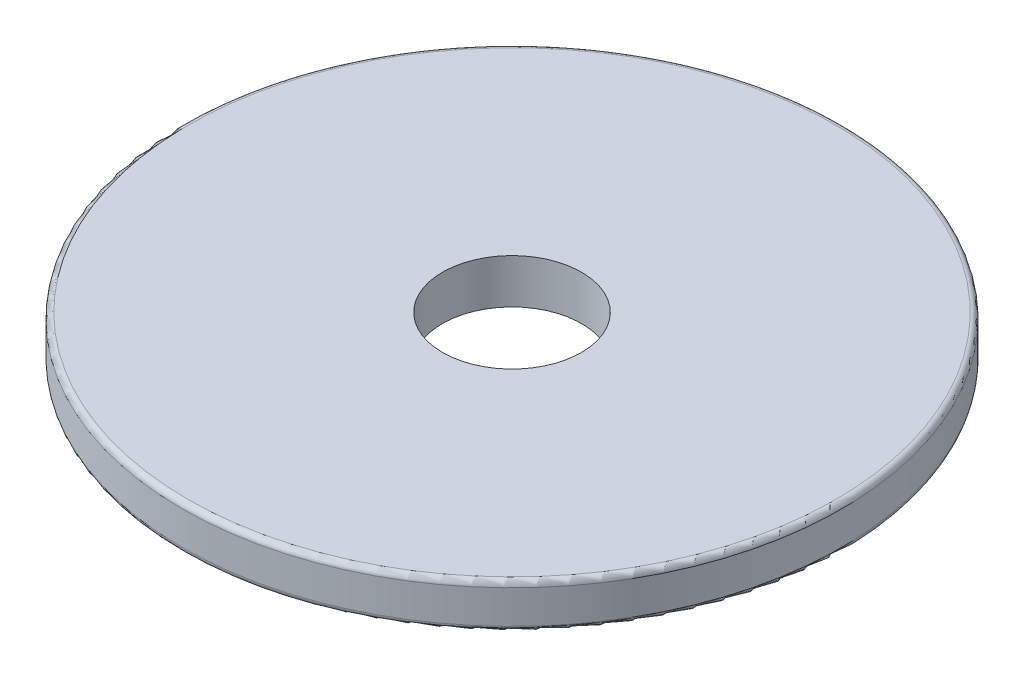
ISO-10303-21;
HEADER;
FILE_DESCRIPTION(('STEP AP214'),'2;1');
FILE_NAME('part.step','',(''),(''),'','','');
FILE_SCHEMA(('AUTOMOTIVE_DESIGN { 1 0 10303 214 1 1 1 1 }'));
ENDSEC;
DATA;
#1=APPLICATION_CONTEXT('core data for automotive mechanical design processes');
#2=APPLICATION_PROTOCOL_DEFINITION('international standard','automotive_design',2000,#1);
#3=PRODUCT_CONTEXT('',#1,'mechanical');
#4=PRODUCT('Part','Part','',(#3));
#5=PRODUCT_RELATED_PRODUCT_CATEGORY('part','',(#4));
#6=PRODUCT_DEFINITION_FORMATION('','',#4);
#7=PRODUCT_DEFINITION_CONTEXT('part definition',#1,'design');
#8=PRODUCT_DEFINITION('design','',#6,#7);
#9=PRODUCT_DEFINITION_SHAPE('','',#8);
#10=(LENGTH_UNIT() NAMED_UNIT(*) SI_UNIT(.MILLI.,.METRE.));
#11=(NAMED_UNIT(*) PLANE_ANGLE_UNIT() SI_UNIT($,.RADIAN.));
#12=(NAMED_UNIT(*) SI_UNIT($,.STERADIAN.) SOLID_ANGLE_UNIT());
#13=UNCERTAINTY_MEASURE_WITH_UNIT(LENGTH_MEASURE(1.E-05),#10,'distance_accuracy_value','');
#14=(GEOMETRIC_REPRESENTATION_CONTEXT(3) GLOBAL_UNCERTAINTY_ASSIGNED_CONTEXT((#13)) GLOBAL_UNIT_ASSIGNED_CONTEXT((#10,
#11,#12)) REPRESENTATION_CONTEXT('',''));
#15=CARTESIAN_POINT('',(0.,0.,0.));
#16=DIRECTION('',(0.,0.,1.));
#17=DIRECTION('',(1.,0.,0.));
#18=AXIS2_PLACEMENT_3D('',#15,#16,#17);
#19=CARTESIAN_POINT('',(0.,0.8,0.));
#20=DIRECTION('',(0.,1.,0.));
#21=DIRECTION('',(0.,0.,1.));
#22=AXIS2_PLACEMENT_3D('',#19,#20,#21);
#23=PLANE('',#22);
#24=CARTESIAN_POINT('',(0.,0.8,0.));
#25=DIRECTION('',(0.,1.,0.));
#26=DIRECTION('',(0.,0.,1.));
#27=AXIS2_PLACEMENT_3D('',#24,#25,#26);
#28=CIRCLE('',#27,11.65);
#29=CARTESIAN_POINT('',(0.,0.8,11.65));
#30=VERTEX_POINT('',#29);
#31=EDGE_CURVE('E10',#30,#30,#28,.T.);
#32=ORIENTED_EDGE('',*,*,#31,.T.);
#33=EDGE_LOOP('',(#32));
#34=FACE_BOUND('',#33,.T.);
#35=CARTESIAN_POINT('',(0.,0.8,0.));
#36=DIRECTION('',(0.,1.,0.));
#37=DIRECTION('',(0.,0.,1.));
#38=AXIS2_PLACEMENT_3D('',#35,#36,#37);
#39=CIRCLE('',#38,2.5);
#40=CARTESIAN_POINT('',(0.,0.8,2.5));
#41=VERTEX_POINT('',#40);
#42=EDGE_CURVE('E54',#41,#41,#39,.T.);
#43=ORIENTED_EDGE('',*,*,#42,.F.);
#44=EDGE_LOOP('',(#43));
#45=FACE_BOUND('',#44,.T.);
#46=ADVANCED_FACE('F34',(#34,#45),#23,.T.);
#47=CARTESIAN_POINT('',(0.,-0.8,0.));
#48=DIRECTION('',(0.,1.,0.));
#49=DIRECTION('',(0.,0.,1.));
#50=AXIS2_PLACEMENT_3D('',#47,#48,#49);
#51=PLANE('',#50);
#52=CARTESIAN_POINT('',(0.,-0.8,0.));
#53=DIRECTION('',(0.,1.,0.));
#54=DIRECTION('',(0.,0.,1.));
#55=AXIS2_PLACEMENT_3D('',#52,#53,#54);
#56=CIRCLE('',#55,11.65);
#57=CARTESIAN_POINT('',(0.,-0.8,11.65));
#58=VERTEX_POINT('',#57);
#59=EDGE_CURVE('E41',#58,#58,#56,.F.);
#60=ORIENTED_EDGE('',*,*,#59,.T.);
#61=EDGE_LOOP('',(#60));
#62=FACE_BOUND('',#61,.T.);
#63=CARTESIAN_POINT('',(0.,-0.8,0.));
#64=DIRECTION('',(0.,1.,0.));
#65=DIRECTION('',(0.,0.,1.));
#66=AXIS2_PLACEMENT_3D('',#63,#64,#65);
#67=CIRCLE('',#66,2.5);
#68=CARTESIAN_POINT('',(0.,-0.8,2.5));
#69=VERTEX_POINT('',#68);
#70=EDGE_CURVE('E55',#69,#69,#67,.T.);
#71=ORIENTED_EDGE('',*,*,#70,.T.);
#72=EDGE_LOOP('',(#71));
#73=FACE_BOUND('',#72,.T.);
#74=ADVANCED_FACE('F65',(#62,#73),#51,.F.);
#75=CARTESIAN_POINT('',(0.,0.8,0.));
#76=DIRECTION('',(0.,-1.,0.));
#77=DIRECTION('',(0.,0.,-1.));
#78=AXIS2_PLACEMENT_3D('',#75,#76,#77);
#79=CYLINDRICAL_SURFACE('',#78,11.85);
#80=CARTESIAN_POINT('',(0.,-0.6,0.));
#81=DIRECTION('',(0.,1.,0.));
#82=DIRECTION('',(0.,0.,1.));
#83=AXIS2_PLACEMENT_3D('',#80,#81,#82);
#84=CIRCLE('',#83,11.85);
#85=CARTESIAN_POINT('',(0.,-0.6,11.85));
#86=VERTEX_POINT('',#85);
#87=EDGE_CURVE('E45',#86,#86,#84,.T.);
#88=ORIENTED_EDGE('',*,*,#87,.T.);
#89=EDGE_LOOP('',(#88));
#90=FACE_BOUND('',#89,.T.);
#91=CARTESIAN_POINT('',(0.,0.6,0.));
#92=DIRECTION('',(0.,1.,0.));
#93=DIRECTION('',(0.,0.,1.));
#94=AXIS2_PLACEMENT_3D('',#91,#92,#93);
#95=CIRCLE('',#94,11.85);
#96=CARTESIAN_POINT('',(0.,0.6,11.85));
#97=VERTEX_POINT('',#96);
#98=EDGE_CURVE('E49',#97,#97,#95,.F.);
#99=ORIENTED_EDGE('',*,*,#98,.T.);
#100=EDGE_LOOP('',(#99));
#101=FACE_BOUND('',#100,.T.);
#102=ADVANCED_FACE('F70',(#90,#101),#79,.T.);
#103=CARTESIAN_POINT('',(0.,0.8,0.));
#104=DIRECTION('',(0.,-1.,0.));
#105=DIRECTION('',(0.,0.,-1.));
#106=AXIS2_PLACEMENT_3D('',#103,#104,#105);
#107=CYLINDRICAL_SURFACE('',#106,2.5);
#108=ORIENTED_EDGE('',*,*,#42,.T.);
#109=EDGE_LOOP('',(#108));
#110=FACE_BOUND('',#109,.T.);
#111=ORIENTED_EDGE('',*,*,#70,.F.);
#112=EDGE_LOOP('',(#111));
#113=FACE_BOUND('',#112,.T.);
#114=ADVANCED_FACE('F61',(#110,#113),#107,.F.);
#115=CARTESIAN_POINT('',(0.,-0.6,0.));
#116=DIRECTION('',(0.,1.,0.));
#117=DIRECTION('',(0.,0.,1.));
#118=AXIS2_PLACEMENT_3D('',#115,#116,#117);
#119=TOROIDAL_SURFACE('',#118,11.65,0.2);
#120=ORIENTED_EDGE('',*,*,#59,.F.);
#121=EDGE_LOOP('',(#120));
#122=FACE_BOUND('',#121,.T.);
#123=ORIENTED_EDGE('',*,*,#87,.F.);
#124=EDGE_LOOP('',(#123));
#125=FACE_BOUND('',#124,.T.);
#126=ADVANCED_FACE('F76',(#122,#125),#119,.T.);
#127=CARTESIAN_POINT('',(0.,0.6,0.));
#128=DIRECTION('',(0.,1.,0.));
#129=DIRECTION('',(0.,0.,1.));
#130=AXIS2_PLACEMENT_3D('',#127,#128,#129);
#131=TOROIDAL_SURFACE('',#130,11.65,0.2);
#132=ORIENTED_EDGE('',*,*,#98,.F.);
#133=EDGE_LOOP('',(#132));
#134=FACE_BOUND('',#133,.T.);
#135=ORIENTED_EDGE('',*,*,#31,.F.);
#136=EDGE_LOOP('',(#135));
#137=FACE_BOUND('',#136,.T.);
#138=ADVANCED_FACE('F36',(#134,#137),#131,.T.);
#139=CLOSED_SHELL('',(#46,#74,#102,#114,#126,#138));
#140=MANIFOLD_SOLID_BREP('B2',#139);
#141=ADVANCED_BREP_SHAPE_REPRESENTATION('',(#18,#140),#14);
#142=SHAPE_DEFINITION_REPRESENTATION(#9,#141);
ENDSEC;
END-ISO-10303-21;
